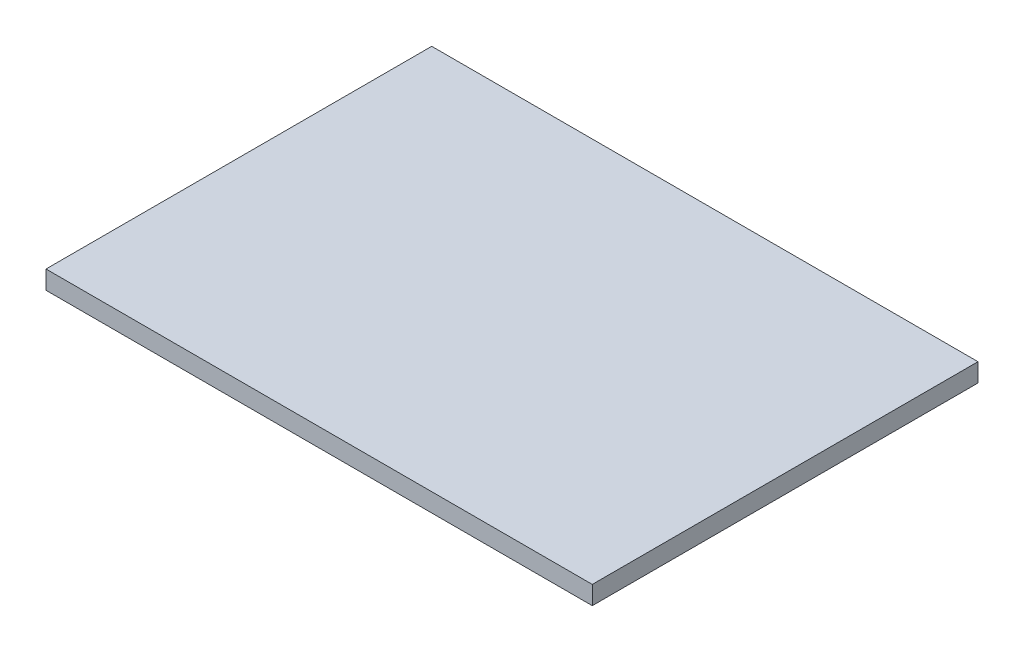
ISO-10303-21;
HEADER;
FILE_DESCRIPTION(('STEP AP214'),'2;1');
FILE_NAME('part.step','',(''),(''),'','','');
FILE_SCHEMA(('AUTOMOTIVE_DESIGN { 1 0 10303 214 1 1 1 1 }'));
ENDSEC;
DATA;
#1=APPLICATION_CONTEXT('core data for automotive mechanical design processes');
#2=APPLICATION_PROTOCOL_DEFINITION('international standard','automotive_design',2000,#1);
#3=PRODUCT_CONTEXT('',#1,'mechanical');
#4=PRODUCT('Part','Part','',(#3));
#5=PRODUCT_RELATED_PRODUCT_CATEGORY('part','',(#4));
#6=PRODUCT_DEFINITION_FORMATION('','',#4);
#7=PRODUCT_DEFINITION_CONTEXT('part definition',#1,'design');
#8=PRODUCT_DEFINITION('design','',#6,#7);
#9=PRODUCT_DEFINITION_SHAPE('','',#8);
#10=(LENGTH_UNIT() NAMED_UNIT(*) SI_UNIT(.MILLI.,.METRE.));
#11=(NAMED_UNIT(*) PLANE_ANGLE_UNIT() SI_UNIT($,.RADIAN.));
#12=(NAMED_UNIT(*) SI_UNIT($,.STERADIAN.) SOLID_ANGLE_UNIT());
#13=UNCERTAINTY_MEASURE_WITH_UNIT(LENGTH_MEASURE(1.E-05),#10,'distance_accuracy_value','');
#14=(GEOMETRIC_REPRESENTATION_CONTEXT(3) GLOBAL_UNCERTAINTY_ASSIGNED_CONTEXT((#13)) GLOBAL_UNIT_ASSIGNED_CONTEXT((#10,
#11,#12)) REPRESENTATION_CONTEXT('',''));
#15=CARTESIAN_POINT('',(0.,0.,0.));
#16=DIRECTION('',(0.,0.,1.));
#17=DIRECTION('',(1.,0.,0.));
#18=AXIS2_PLACEMENT_3D('',#15,#16,#17);
#19=CARTESIAN_POINT('',(148.,10.,104.5));
#20=DIRECTION('',(-1.,0.,0.));
#21=DIRECTION('',(0.,0.,1.));
#22=AXIS2_PLACEMENT_3D('',#19,#20,#21);
#23=PLANE('',#22);
#24=DIRECTION('',(0.,0.,-1.));
#25=VECTOR('',#24,1.);
#26=CARTESIAN_POINT('',(148.,0.,104.5));
#27=LINE('',#26,#25);
#28=CARTESIAN_POINT('',(148.,0.,104.5));
#29=VERTEX_POINT('',#28);
#30=CARTESIAN_POINT('',(148.,0.,-104.5));
#31=VERTEX_POINT('',#30);
#32=EDGE_CURVE('E94',#29,#31,#27,.T.);
#33=ORIENTED_EDGE('',*,*,#32,.T.);
#34=DIRECTION('',(0.,-1.,0.));
#35=VECTOR('',#34,1.);
#36=CARTESIAN_POINT('',(148.,10.,-104.5));
#37=LINE('',#36,#35);
#38=CARTESIAN_POINT('',(148.,10.,-104.5));
#39=VERTEX_POINT('',#38);
#40=EDGE_CURVE('E11',#39,#31,#37,.T.);
#41=ORIENTED_EDGE('',*,*,#40,.F.);
#42=DIRECTION('',(0.,0.,-1.));
#43=VECTOR('',#42,1.);
#44=CARTESIAN_POINT('',(148.,10.,104.5));
#45=LINE('',#44,#43);
#46=CARTESIAN_POINT('',(148.,10.,104.5));
#47=VERTEX_POINT('',#46);
#48=EDGE_CURVE('E82',#47,#39,#45,.T.);
#49=ORIENTED_EDGE('',*,*,#48,.F.);
#50=DIRECTION('',(0.,-1.,0.));
#51=VECTOR('',#50,1.);
#52=CARTESIAN_POINT('',(148.,10.,104.5));
#53=LINE('',#52,#51);
#54=EDGE_CURVE('E90',#47,#29,#53,.T.);
#55=ORIENTED_EDGE('',*,*,#54,.T.);
#56=EDGE_LOOP('',(#33,#41,#49,#55));
#57=FACE_BOUND('',#56,.T.);
#58=ADVANCED_FACE('F31',(#57),#23,.F.);
#59=CARTESIAN_POINT('',(-148.,10.,-104.5));
#60=DIRECTION('',(0.,0.,1.));
#61=DIRECTION('',(1.,0.,0.));
#62=AXIS2_PLACEMENT_3D('',#59,#60,#61);
#63=PLANE('',#62);
#64=DIRECTION('',(-1.,0.,0.));
#65=VECTOR('',#64,1.);
#66=CARTESIAN_POINT('',(-148.,0.,-104.5));
#67=LINE('',#66,#65);
#68=CARTESIAN_POINT('',(-148.,0.,-104.5));
#69=VERTEX_POINT('',#68);
#70=EDGE_CURVE('E86',#31,#69,#67,.T.);
#71=ORIENTED_EDGE('',*,*,#70,.T.);
#72=DIRECTION('',(0.,-1.,0.));
#73=VECTOR('',#72,1.);
#74=CARTESIAN_POINT('',(-148.,10.,-104.5));
#75=LINE('',#74,#73);
#76=CARTESIAN_POINT('',(-148.,10.,-104.5));
#77=VERTEX_POINT('',#76);
#78=EDGE_CURVE('E39',#77,#69,#75,.T.);
#79=ORIENTED_EDGE('',*,*,#78,.F.);
#80=DIRECTION('',(-1.,0.,0.));
#81=VECTOR('',#80,1.);
#82=CARTESIAN_POINT('',(-148.,10.,-104.5));
#83=LINE('',#82,#81);
#84=EDGE_CURVE('E77',#39,#77,#83,.T.);
#85=ORIENTED_EDGE('',*,*,#84,.F.);
#86=ORIENTED_EDGE('',*,*,#40,.T.);
#87=EDGE_LOOP('',(#71,#79,#85,#86));
#88=FACE_BOUND('',#87,.T.);
#89=ADVANCED_FACE('F85',(#88),#63,.F.);
#90=CARTESIAN_POINT('',(-148.,10.,104.5));
#91=DIRECTION('',(1.,0.,0.));
#92=DIRECTION('',(0.,0.,-1.));
#93=AXIS2_PLACEMENT_3D('',#90,#91,#92);
#94=PLANE('',#93);
#95=DIRECTION('',(0.,0.,1.));
#96=VECTOR('',#95,1.);
#97=CARTESIAN_POINT('',(-148.,0.,104.5));
#98=LINE('',#97,#96);
#99=CARTESIAN_POINT('',(-148.,0.,104.5));
#100=VERTEX_POINT('',#99);
#101=EDGE_CURVE('E64',#69,#100,#98,.T.);
#102=ORIENTED_EDGE('',*,*,#101,.T.);
#103=DIRECTION('',(0.,-1.,0.));
#104=VECTOR('',#103,1.);
#105=CARTESIAN_POINT('',(-148.,10.,104.5));
#106=LINE('',#105,#104);
#107=CARTESIAN_POINT('',(-148.,10.,104.5));
#108=VERTEX_POINT('',#107);
#109=EDGE_CURVE('E87',#108,#100,#106,.T.);
#110=ORIENTED_EDGE('',*,*,#109,.F.);
#111=DIRECTION('',(0.,0.,1.));
#112=VECTOR('',#111,1.);
#113=CARTESIAN_POINT('',(-148.,10.,104.5));
#114=LINE('',#113,#112);
#115=EDGE_CURVE('E80',#77,#108,#114,.T.);
#116=ORIENTED_EDGE('',*,*,#115,.F.);
#117=ORIENTED_EDGE('',*,*,#78,.T.);
#118=EDGE_LOOP('',(#102,#110,#116,#117));
#119=FACE_BOUND('',#118,.T.);
#120=ADVANCED_FACE('F88',(#119),#94,.F.);
#121=CARTESIAN_POINT('',(-148.,10.,104.5));
#122=DIRECTION('',(0.,0.,-1.));
#123=DIRECTION('',(-1.,0.,0.));
#124=AXIS2_PLACEMENT_3D('',#121,#122,#123);
#125=PLANE('',#124);
#126=DIRECTION('',(1.,0.,0.));
#127=VECTOR('',#126,1.);
#128=CARTESIAN_POINT('',(-148.,0.,104.5));
#129=LINE('',#128,#127);
#130=EDGE_CURVE('E70',#100,#29,#129,.T.);
#131=ORIENTED_EDGE('',*,*,#130,.T.);
#132=ORIENTED_EDGE('',*,*,#54,.F.);
#133=DIRECTION('',(1.,0.,0.));
#134=VECTOR('',#133,1.);
#135=CARTESIAN_POINT('',(-148.,10.,104.5));
#136=LINE('',#135,#134);
#137=EDGE_CURVE('E47',#108,#47,#136,.T.);
#138=ORIENTED_EDGE('',*,*,#137,.F.);
#139=ORIENTED_EDGE('',*,*,#109,.T.);
#140=EDGE_LOOP('',(#131,#132,#138,#139));
#141=FACE_BOUND('',#140,.T.);
#142=ADVANCED_FACE('F101',(#141),#125,.F.);
#143=CARTESIAN_POINT('',(148.,10.,-104.5));
#144=DIRECTION('',(0.,-1.,0.));
#145=DIRECTION('',(0.,0.,-1.));
#146=AXIS2_PLACEMENT_3D('',#143,#144,#145);
#147=PLANE('',#146);
#148=ORIENTED_EDGE('',*,*,#48,.T.);
#149=ORIENTED_EDGE('',*,*,#84,.T.);
#150=ORIENTED_EDGE('',*,*,#115,.T.);
#151=ORIENTED_EDGE('',*,*,#137,.T.);
#152=EDGE_LOOP('',(#148,#149,#150,#151));
#153=FACE_BOUND('',#152,.T.);
#154=ADVANCED_FACE('F78',(#153),#147,.F.);
#155=CARTESIAN_POINT('',(148.,0.,-104.5));
#156=DIRECTION('',(0.,-1.,0.));
#157=DIRECTION('',(0.,0.,-1.));
#158=AXIS2_PLACEMENT_3D('',#155,#156,#157);
#159=PLANE('',#158);
#160=ORIENTED_EDGE('',*,*,#32,.F.);
#161=ORIENTED_EDGE('',*,*,#130,.F.);
#162=ORIENTED_EDGE('',*,*,#101,.F.);
#163=ORIENTED_EDGE('',*,*,#70,.F.);
#164=EDGE_LOOP('',(#160,#161,#162,#163));
#165=FACE_BOUND('',#164,.T.);
#166=ADVANCED_FACE('F104',(#165),#159,.T.);
#167=CLOSED_SHELL('',(#58,#89,#120,#142,#154,#166));
#168=MANIFOLD_SOLID_BREP('B2',#167);
#169=ADVANCED_BREP_SHAPE_REPRESENTATION('',(#18,#168),#14);
#170=SHAPE_DEFINITION_REPRESENTATION(#9,#169);
ENDSEC;
END-ISO-10303-21;
